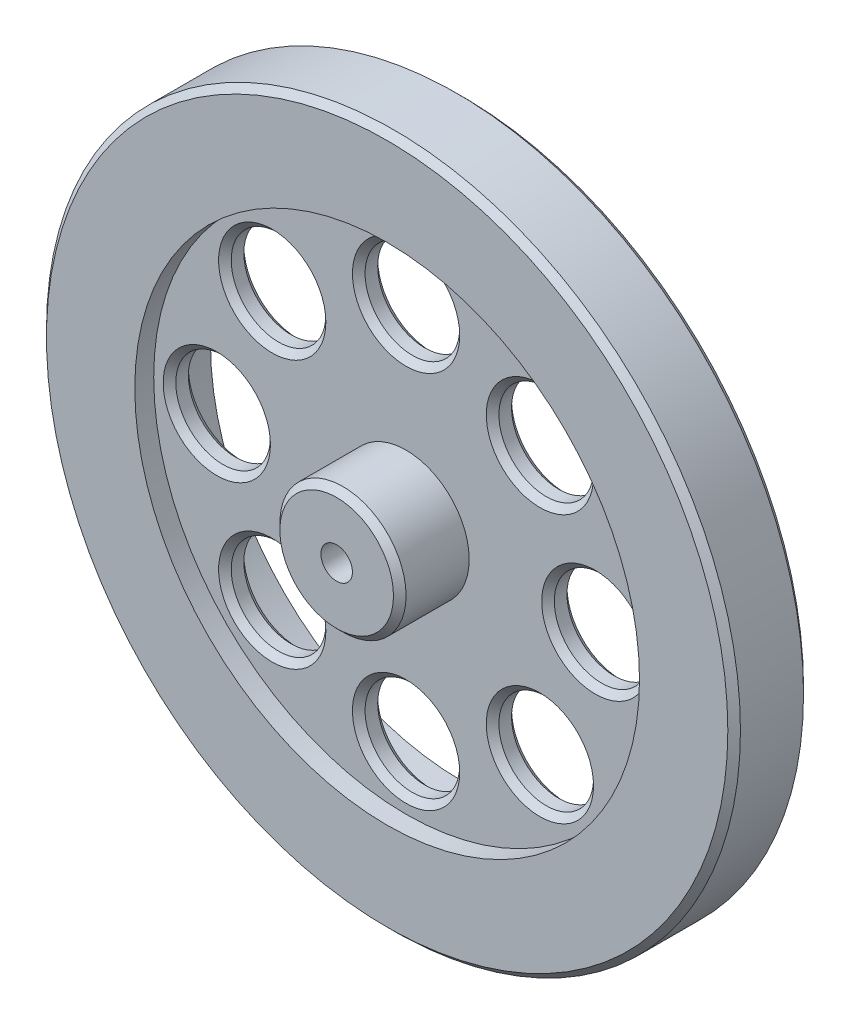
ISO-10303-21;
HEADER;
FILE_DESCRIPTION(('STEP AP214'),'2;1');
FILE_NAME('part.step','',(''),(''),'','','');
FILE_SCHEMA(('AUTOMOTIVE_DESIGN { 1 0 10303 214 1 1 1 1 }'));
ENDSEC;
DATA;
#1=APPLICATION_CONTEXT('core data for automotive mechanical design processes');
#2=APPLICATION_PROTOCOL_DEFINITION('international standard','automotive_design',2000,#1);
#3=PRODUCT_CONTEXT('',#1,'mechanical');
#4=PRODUCT('Part','Part','',(#3));
#5=PRODUCT_RELATED_PRODUCT_CATEGORY('part','',(#4));
#6=PRODUCT_DEFINITION_FORMATION('','',#4);
#7=PRODUCT_DEFINITION_CONTEXT('part definition',#1,'design');
#8=PRODUCT_DEFINITION('design','',#6,#7);
#9=PRODUCT_DEFINITION_SHAPE('','',#8);
#10=(LENGTH_UNIT() NAMED_UNIT(*) SI_UNIT(.MILLI.,.METRE.));
#11=(NAMED_UNIT(*) PLANE_ANGLE_UNIT() SI_UNIT($,.RADIAN.));
#12=(NAMED_UNIT(*) SI_UNIT($,.STERADIAN.) SOLID_ANGLE_UNIT());
#13=UNCERTAINTY_MEASURE_WITH_UNIT(LENGTH_MEASURE(1.E-05),#10,'distance_accuracy_value','');
#14=(GEOMETRIC_REPRESENTATION_CONTEXT(3) GLOBAL_UNCERTAINTY_ASSIGNED_CONTEXT((#13)) GLOBAL_UNIT_ASSIGNED_CONTEXT((#10,
#11,#12)) REPRESENTATION_CONTEXT('',''));
#15=CARTESIAN_POINT('',(0.,0.,0.));
#16=DIRECTION('',(0.,0.,1.));
#17=DIRECTION('',(1.,0.,0.));
#18=AXIS2_PLACEMENT_3D('',#15,#16,#17);
#19=CARTESIAN_POINT('',(0.,0.,12.));
#20=DIRECTION('',(0.,0.,-1.));
#21=DIRECTION('',(-1.,0.,0.));
#22=AXIS2_PLACEMENT_3D('',#19,#20,#21);
#23=CYLINDRICAL_SURFACE('',#22,55.);
#24=CARTESIAN_POINT('',(0.,0.,11.));
#25=DIRECTION('',(0.,0.,1.));
#26=DIRECTION('',(1.,0.,0.));
#27=AXIS2_PLACEMENT_3D('',#24,#25,#26);
#28=CIRCLE('',#27,55.);
#29=CARTESIAN_POINT('',(55.,0.,11.));
#30=VERTEX_POINT('',#29);
#31=EDGE_CURVE('E149',#30,#30,#28,.F.);
#32=ORIENTED_EDGE('',*,*,#31,.T.);
#33=EDGE_LOOP('',(#32));
#34=FACE_BOUND('',#33,.T.);
#35=CARTESIAN_POINT('',(0.,0.,1.00000000000001));
#36=DIRECTION('',(0.,0.,1.));
#37=DIRECTION('',(1.,0.,0.));
#38=AXIS2_PLACEMENT_3D('',#35,#36,#37);
#39=CIRCLE('',#38,55.);
#40=CARTESIAN_POINT('',(55.,0.,1.00000000000001));
#41=VERTEX_POINT('',#40);
#42=EDGE_CURVE('E152',#41,#41,#39,.T.);
#43=ORIENTED_EDGE('',*,*,#42,.T.);
#44=EDGE_LOOP('',(#43));
#45=FACE_BOUND('',#44,.T.);
#46=ADVANCED_FACE('F35',(#34,#45),#23,.T.);
#47=CARTESIAN_POINT('',(0.,0.,12.));
#48=DIRECTION('',(0.,0.,1.));
#49=DIRECTION('',(1.,0.,0.));
#50=AXIS2_PLACEMENT_3D('',#47,#48,#49);
#51=PLANE('',#50);
#52=CARTESIAN_POINT('',(0.,0.,12.));
#53=DIRECTION('',(0.,0.,1.));
#54=DIRECTION('',(1.,0.,0.));
#55=AXIS2_PLACEMENT_3D('',#52,#53,#54);
#56=CIRCLE('',#55,54.);
#57=CARTESIAN_POINT('',(54.,0.,12.));
#58=VERTEX_POINT('',#57);
#59=EDGE_CURVE('E155',#58,#58,#56,.T.);
#60=ORIENTED_EDGE('',*,*,#59,.T.);
#61=EDGE_LOOP('',(#60));
#62=FACE_BOUND('',#61,.T.);
#63=CARTESIAN_POINT('',(0.,0.,12.));
#64=DIRECTION('',(0.,0.,1.));
#65=DIRECTION('',(1.,0.,0.));
#66=AXIS2_PLACEMENT_3D('',#63,#64,#65);
#67=CIRCLE('',#66,40.);
#68=CARTESIAN_POINT('',(40.,0.,12.));
#69=VERTEX_POINT('',#68);
#70=EDGE_CURVE('E165',#69,#69,#67,.T.);
#71=ORIENTED_EDGE('',*,*,#70,.F.);
#72=EDGE_LOOP('',(#71));
#73=FACE_BOUND('',#72,.T.);
#74=ADVANCED_FACE('F198',(#62,#73),#51,.T.);
#75=CARTESIAN_POINT('',(0.,0.,0.));
#76=DIRECTION('',(0.,0.,1.));
#77=DIRECTION('',(1.,0.,0.));
#78=AXIS2_PLACEMENT_3D('',#75,#76,#77);
#79=PLANE('',#78);
#80=CARTESIAN_POINT('',(0.,0.,0.));
#81=DIRECTION('',(0.,0.,1.));
#82=DIRECTION('',(1.,0.,0.));
#83=AXIS2_PLACEMENT_3D('',#80,#81,#82);
#84=CIRCLE('',#83,54.);
#85=CARTESIAN_POINT('',(54.,0.,0.));
#86=VERTEX_POINT('',#85);
#87=EDGE_CURVE('E10',#86,#86,#84,.F.);
#88=ORIENTED_EDGE('',*,*,#87,.T.);
#89=EDGE_LOOP('',(#88));
#90=FACE_BOUND('',#89,.T.);
#91=CARTESIAN_POINT('',(0.,0.,0.));
#92=DIRECTION('',(0.,0.,-1.));
#93=DIRECTION('',(-1.,0.,0.));
#94=AXIS2_PLACEMENT_3D('',#91,#92,#93);
#95=CIRCLE('',#94,40.);
#96=CARTESIAN_POINT('',(-40.,0.,0.));
#97=VERTEX_POINT('',#96);
#98=EDGE_CURVE('E159',#97,#97,#95,.T.);
#99=ORIENTED_EDGE('',*,*,#98,.F.);
#100=EDGE_LOOP('',(#99));
#101=FACE_BOUND('',#100,.T.);
#102=ADVANCED_FACE('F204',(#90,#101),#79,.F.);
#103=CARTESIAN_POINT('',(0.,0.,5.));
#104=DIRECTION('',(0.,0.,-1.));
#105=DIRECTION('',(-1.,0.,0.));
#106=AXIS2_PLACEMENT_3D('',#103,#104,#105);
#107=CYLINDRICAL_SURFACE('',#106,40.);
#108=CARTESIAN_POINT('',(0.,0.,5.));
#109=DIRECTION('',(0.,0.,-1.));
#110=DIRECTION('',(-1.,0.,0.));
#111=AXIS2_PLACEMENT_3D('',#108,#109,#110);
#112=CIRCLE('',#111,40.);
#113=CARTESIAN_POINT('',(-40.,0.,5.));
#114=VERTEX_POINT('',#113);
#115=EDGE_CURVE('E158',#114,#114,#112,.T.);
#116=ORIENTED_EDGE('',*,*,#115,.F.);
#117=EDGE_LOOP('',(#116));
#118=FACE_BOUND('',#117,.T.);
#119=ORIENTED_EDGE('',*,*,#98,.T.);
#120=EDGE_LOOP('',(#119));
#121=FACE_BOUND('',#120,.T.);
#122=ADVANCED_FACE('F586',(#118,#121),#107,.F.);
#123=CARTESIAN_POINT('',(0.,0.,5.));
#124=DIRECTION('',(0.,0.,-1.));
#125=DIRECTION('',(-1.,0.,0.));
#126=AXIS2_PLACEMENT_3D('',#123,#124,#125);
#127=PLANE('',#126);
#128=CARTESIAN_POINT('',(-29.9999999999987,-1.27713995416946E-12,5.));
#129=DIRECTION('',(0.,0.,-1.));
#130=DIRECTION('',(-1.,0.,0.));
#131=AXIS2_PLACEMENT_3D('',#128,#129,#130);
#132=CIRCLE('',#131,8.50000000000186);
#133=CARTESIAN_POINT('',(-38.5000000000006,-1.27713995416946E-12,5.));
#134=VERTEX_POINT('',#133);
#135=EDGE_CURVE('E113',#134,#134,#132,.F.);
#136=ORIENTED_EDGE('',*,*,#135,.T.);
#137=EDGE_LOOP('',(#136));
#138=FACE_BOUND('',#137,.T.);
#139=CARTESIAN_POINT('',(-21.2132034355961,21.2132034355955,5.));
#140=DIRECTION('',(0.,0.,-1.));
#141=DIRECTION('',(-1.,0.,0.));
#142=AXIS2_PLACEMENT_3D('',#139,#140,#141);
#143=CIRCLE('',#142,8.50000000000101);
#144=CARTESIAN_POINT('',(-29.7132034355971,21.2132034355955,5.));
#145=VERTEX_POINT('',#144);
#146=EDGE_CURVE('E116',#145,#145,#143,.F.);
#147=ORIENTED_EDGE('',*,*,#146,.T.);
#148=EDGE_LOOP('',(#147));
#149=FACE_BOUND('',#148,.T.);
#150=CARTESIAN_POINT('',(0.,30.,5.));
#151=DIRECTION('',(0.,0.,-1.));
#152=DIRECTION('',(-1.,0.,0.));
#153=AXIS2_PLACEMENT_3D('',#150,#151,#152);
#154=CIRCLE('',#153,8.50000000000001);
#155=CARTESIAN_POINT('',(-8.50000000000001,30.,5.));
#156=VERTEX_POINT('',#155);
#157=EDGE_CURVE('E119',#156,#156,#154,.F.);
#158=ORIENTED_EDGE('',*,*,#157,.T.);
#159=EDGE_LOOP('',(#158));
#160=FACE_BOUND('',#159,.T.);
#161=CARTESIAN_POINT('',(21.2132034355968,21.2132034355973,5.));
#162=DIRECTION('',(0.,0.,-1.));
#163=DIRECTION('',(-1.,0.,0.));
#164=AXIS2_PLACEMENT_3D('',#161,#162,#163);
#165=CIRCLE('',#164,8.50000000000012);
#166=CARTESIAN_POINT('',(12.7132034355967,21.2132034355973,5.));
#167=VERTEX_POINT('',#166);
#168=EDGE_CURVE('E122',#167,#167,#165,.F.);
#169=ORIENTED_EDGE('',*,*,#168,.T.);
#170=EDGE_LOOP('',(#169));
#171=FACE_BOUND('',#170,.T.);
#172=CARTESIAN_POINT('',(30.0000000000013,1.27346601377202E-12,5.));
#173=DIRECTION('',(0.,0.,-1.));
#174=DIRECTION('',(-1.,0.,0.));
#175=AXIS2_PLACEMENT_3D('',#172,#173,#174);
#176=CIRCLE('',#175,8.50000000000094);
#177=CARTESIAN_POINT('',(21.5000000000003,1.27346601377202E-12,5.));
#178=VERTEX_POINT('',#177);
#179=EDGE_CURVE('E125',#178,#178,#176,.F.);
#180=ORIENTED_EDGE('',*,*,#179,.T.);
#181=EDGE_LOOP('',(#180));
#182=FACE_BOUND('',#181,.T.);
#183=CARTESIAN_POINT('',(21.2132034355986,-21.2132034355955,5.));
#184=DIRECTION('',(0.,0.,-1.));
#185=DIRECTION('',(-1.,0.,0.));
#186=AXIS2_PLACEMENT_3D('',#183,#184,#185);
#187=CIRCLE('',#186,8.50000000000198);
#188=CARTESIAN_POINT('',(12.7132034355966,-21.2132034355955,5.));
#189=VERTEX_POINT('',#188);
#190=EDGE_CURVE('E128',#189,#189,#187,.F.);
#191=ORIENTED_EDGE('',*,*,#190,.T.);
#192=EDGE_LOOP('',(#191));
#193=FACE_BOUND('',#192,.T.);
#194=CARTESIAN_POINT('',(2.54693202754403E-12,-30.,5.));
#195=DIRECTION('',(0.,0.,-1.));
#196=DIRECTION('',(-1.,0.,0.));
#197=AXIS2_PLACEMENT_3D('',#194,#195,#196);
#198=CIRCLE('',#197,8.50000000000263);
#199=CARTESIAN_POINT('',(-8.50000000000008,-30.,5.));
#200=VERTEX_POINT('',#199);
#201=EDGE_CURVE('E131',#200,#200,#198,.F.);
#202=ORIENTED_EDGE('',*,*,#201,.T.);
#203=EDGE_LOOP('',(#202));
#204=FACE_BOUND('',#203,.T.);
#205=CARTESIAN_POINT('',(-21.2132034355943,-21.2132034355973,5.));
#206=DIRECTION('',(0.,0.,-1.));
#207=DIRECTION('',(-1.,0.,0.));
#208=AXIS2_PLACEMENT_3D('',#205,#206,#207);
#209=CIRCLE('',#208,8.50000000000257);
#210=CARTESIAN_POINT('',(-29.7132034355968,-21.2132034355973,5.));
#211=VERTEX_POINT('',#210);
#212=EDGE_CURVE('E134',#211,#211,#209,.F.);
#213=ORIENTED_EDGE('',*,*,#212,.T.);
#214=EDGE_LOOP('',(#213));
#215=FACE_BOUND('',#214,.T.);
#216=CARTESIAN_POINT('',(0.,0.,5.));
#217=DIRECTION('',(0.,0.,-1.));
#218=DIRECTION('',(-1.,0.,0.));
#219=AXIS2_PLACEMENT_3D('',#216,#217,#218);
#220=CIRCLE('',#219,2.5);
#221=CARTESIAN_POINT('',(-2.5,0.,5.));
#222=VERTEX_POINT('',#221);
#223=EDGE_CURVE('E173',#222,#222,#220,.T.);
#224=ORIENTED_EDGE('',*,*,#223,.F.);
#225=EDGE_LOOP('',(#224));
#226=FACE_BOUND('',#225,.T.);
#227=ORIENTED_EDGE('',*,*,#115,.T.);
#228=EDGE_LOOP('',(#227));
#229=FACE_BOUND('',#228,.T.);
#230=ADVANCED_FACE('F577',(#138,#149,#160,#171,#182,#193,#204,#215,#226,#229),#127,.T.);
#231=CARTESIAN_POINT('',(0.,0.,9.));
#232=DIRECTION('',(0.,0.,1.));
#233=DIRECTION('',(1.,0.,0.));
#234=AXIS2_PLACEMENT_3D('',#231,#232,#233);
#235=CYLINDRICAL_SURFACE('',#234,40.);
#236=CARTESIAN_POINT('',(0.,0.,9.));
#237=DIRECTION('',(0.,0.,1.));
#238=DIRECTION('',(1.,0.,0.));
#239=AXIS2_PLACEMENT_3D('',#236,#237,#238);
#240=CIRCLE('',#239,40.);
#241=CARTESIAN_POINT('',(40.,0.,9.));
#242=VERTEX_POINT('',#241);
#243=EDGE_CURVE('E162',#242,#242,#240,.T.);
#244=ORIENTED_EDGE('',*,*,#243,.F.);
#245=EDGE_LOOP('',(#244));
#246=FACE_BOUND('',#245,.T.);
#247=ORIENTED_EDGE('',*,*,#70,.T.);
#248=EDGE_LOOP('',(#247));
#249=FACE_BOUND('',#248,.T.);
#250=ADVANCED_FACE('F568',(#246,#249),#235,.F.);
#251=CARTESIAN_POINT('',(0.,0.,9.));
#252=DIRECTION('',(0.,0.,1.));
#253=DIRECTION('',(1.,0.,0.));
#254=AXIS2_PLACEMENT_3D('',#251,#252,#253);
#255=PLANE('',#254);
#256=CARTESIAN_POINT('',(-29.9999999999987,-1.27713995416946E-12,9.));
#257=DIRECTION('',(0.,0.,1.));
#258=DIRECTION('',(1.,0.,0.));
#259=AXIS2_PLACEMENT_3D('',#256,#257,#258);
#260=CIRCLE('',#259,8.50000000000191);
#261=CARTESIAN_POINT('',(-21.4999999999968,-1.27713995416946E-12,9.));
#262=VERTEX_POINT('',#261);
#263=EDGE_CURVE('E89',#262,#262,#260,.F.);
#264=ORIENTED_EDGE('',*,*,#263,.T.);
#265=EDGE_LOOP('',(#264));
#266=FACE_BOUND('',#265,.T.);
#267=CARTESIAN_POINT('',(-21.2132034355961,21.2132034355955,9.));
#268=DIRECTION('',(0.,0.,1.));
#269=DIRECTION('',(1.,0.,0.));
#270=AXIS2_PLACEMENT_3D('',#267,#268,#269);
#271=CIRCLE('',#270,8.50000000000101);
#272=CARTESIAN_POINT('',(-12.7132034355951,21.2132034355955,9.));
#273=VERTEX_POINT('',#272);
#274=EDGE_CURVE('E92',#273,#273,#271,.F.);
#275=ORIENTED_EDGE('',*,*,#274,.T.);
#276=EDGE_LOOP('',(#275));
#277=FACE_BOUND('',#276,.T.);
#278=CARTESIAN_POINT('',(0.,30.,9.));
#279=DIRECTION('',(0.,0.,1.));
#280=DIRECTION('',(1.,0.,0.));
#281=AXIS2_PLACEMENT_3D('',#278,#279,#280);
#282=CIRCLE('',#281,8.50000000000001);
#283=CARTESIAN_POINT('',(8.50000000000001,30.,9.));
#284=VERTEX_POINT('',#283);
#285=EDGE_CURVE('E95',#284,#284,#282,.F.);
#286=ORIENTED_EDGE('',*,*,#285,.T.);
#287=EDGE_LOOP('',(#286));
#288=FACE_BOUND('',#287,.T.);
#289=CARTESIAN_POINT('',(21.2132034355968,21.2132034355973,9.));
#290=DIRECTION('',(0.,0.,1.));
#291=DIRECTION('',(1.,0.,0.));
#292=AXIS2_PLACEMENT_3D('',#289,#290,#291);
#293=CIRCLE('',#292,8.50000000000016);
#294=CARTESIAN_POINT('',(29.713203435597,21.2132034355973,9.));
#295=VERTEX_POINT('',#294);
#296=EDGE_CURVE('E98',#295,#295,#293,.F.);
#297=ORIENTED_EDGE('',*,*,#296,.T.);
#298=EDGE_LOOP('',(#297));
#299=FACE_BOUND('',#298,.T.);
#300=CARTESIAN_POINT('',(30.0000000000013,1.27346601377202E-12,9.));
#301=DIRECTION('',(0.,0.,1.));
#302=DIRECTION('',(1.,0.,0.));
#303=AXIS2_PLACEMENT_3D('',#300,#301,#302);
#304=CIRCLE('',#303,8.50000000000094);
#305=CARTESIAN_POINT('',(38.5000000000022,1.27346601377202E-12,9.));
#306=VERTEX_POINT('',#305);
#307=EDGE_CURVE('E101',#306,#306,#304,.F.);
#308=ORIENTED_EDGE('',*,*,#307,.T.);
#309=EDGE_LOOP('',(#308));
#310=FACE_BOUND('',#309,.T.);
#311=CARTESIAN_POINT('',(21.2132034355986,-21.2132034355955,9.));
#312=DIRECTION('',(0.,0.,1.));
#313=DIRECTION('',(1.,0.,0.));
#314=AXIS2_PLACEMENT_3D('',#311,#312,#313);
#315=CIRCLE('',#314,8.50000000000199);
#316=CARTESIAN_POINT('',(29.7132034356006,-21.2132034355955,9.));
#317=VERTEX_POINT('',#316);
#318=EDGE_CURVE('E104',#317,#317,#315,.F.);
#319=ORIENTED_EDGE('',*,*,#318,.T.);
#320=EDGE_LOOP('',(#319));
#321=FACE_BOUND('',#320,.T.);
#322=CARTESIAN_POINT('',(2.54693202754403E-12,-30.,9.));
#323=DIRECTION('',(0.,0.,1.));
#324=DIRECTION('',(1.,0.,0.));
#325=AXIS2_PLACEMENT_3D('',#322,#323,#324);
#326=CIRCLE('',#325,8.50000000000263);
#327=CARTESIAN_POINT('',(8.50000000000518,-30.,9.));
#328=VERTEX_POINT('',#327);
#329=EDGE_CURVE('E107',#328,#328,#326,.F.);
#330=ORIENTED_EDGE('',*,*,#329,.T.);
#331=EDGE_LOOP('',(#330));
#332=FACE_BOUND('',#331,.T.);
#333=CARTESIAN_POINT('',(-21.2132034355943,-21.2132034355973,9.));
#334=DIRECTION('',(0.,0.,1.));
#335=DIRECTION('',(1.,0.,0.));
#336=AXIS2_PLACEMENT_3D('',#333,#334,#335);
#337=CIRCLE('',#336,8.50000000000261);
#338=CARTESIAN_POINT('',(-12.7132034355916,-21.2132034355973,9.));
#339=VERTEX_POINT('',#338);
#340=EDGE_CURVE('E110',#339,#339,#337,.F.);
#341=ORIENTED_EDGE('',*,*,#340,.T.);
#342=EDGE_LOOP('',(#341));
#343=FACE_BOUND('',#342,.T.);
#344=CARTESIAN_POINT('',(0.,0.,9.));
#345=DIRECTION('',(0.,0.,1.));
#346=DIRECTION('',(1.,0.,0.));
#347=AXIS2_PLACEMENT_3D('',#344,#345,#346);
#348=CIRCLE('',#347,10.);
#349=CARTESIAN_POINT('',(10.,0.,9.));
#350=VERTEX_POINT('',#349);
#351=EDGE_CURVE('E168',#350,#350,#348,.T.);
#352=ORIENTED_EDGE('',*,*,#351,.F.);
#353=EDGE_LOOP('',(#352));
#354=FACE_BOUND('',#353,.T.);
#355=ORIENTED_EDGE('',*,*,#243,.T.);
#356=EDGE_LOOP('',(#355));
#357=FACE_BOUND('',#356,.T.);
#358=ADVANCED_FACE('F194',(#266,#277,#288,#299,#310,#321,#332,#343,#354,#357),#255,.T.);
#359=CARTESIAN_POINT('',(0.,0.,20.));
#360=DIRECTION('',(0.,0.,-1.));
#361=DIRECTION('',(-1.,0.,0.));
#362=AXIS2_PLACEMENT_3D('',#359,#360,#361);
#363=CYLINDRICAL_SURFACE('',#362,10.);
#364=CARTESIAN_POINT('',(0.,0.,19.));
#365=DIRECTION('',(0.,0.,1.));
#366=DIRECTION('',(1.,0.,0.));
#367=AXIS2_PLACEMENT_3D('',#364,#365,#366);
#368=CIRCLE('',#367,10.);
#369=CARTESIAN_POINT('',(10.,0.,19.));
#370=VERTEX_POINT('',#369);
#371=EDGE_CURVE('E143',#370,#370,#368,.F.);
#372=ORIENTED_EDGE('',*,*,#371,.T.);
#373=EDGE_LOOP('',(#372));
#374=FACE_BOUND('',#373,.T.);
#375=ORIENTED_EDGE('',*,*,#351,.T.);
#376=EDGE_LOOP('',(#375));
#377=FACE_BOUND('',#376,.T.);
#378=ADVANCED_FACE('F184',(#374,#377),#363,.T.);
#379=CARTESIAN_POINT('',(0.,0.,20.));
#380=DIRECTION('',(0.,0.,1.));
#381=DIRECTION('',(1.,0.,0.));
#382=AXIS2_PLACEMENT_3D('',#379,#380,#381);
#383=PLANE('',#382);
#384=CARTESIAN_POINT('',(0.,0.,20.));
#385=DIRECTION('',(0.,0.,1.));
#386=DIRECTION('',(1.,0.,0.));
#387=AXIS2_PLACEMENT_3D('',#384,#385,#386);
#388=CIRCLE('',#387,9.00000000000002);
#389=CARTESIAN_POINT('',(9.00000000000002,0.,20.));
#390=VERTEX_POINT('',#389);
#391=EDGE_CURVE('E146',#390,#390,#388,.T.);
#392=ORIENTED_EDGE('',*,*,#391,.T.);
#393=EDGE_LOOP('',(#392));
#394=FACE_BOUND('',#393,.T.);
#395=CARTESIAN_POINT('',(0.,0.,20.));
#396=DIRECTION('',(0.,0.,1.));
#397=DIRECTION('',(1.,0.,0.));
#398=AXIS2_PLACEMENT_3D('',#395,#396,#397);
#399=CIRCLE('',#398,2.5);
#400=CARTESIAN_POINT('',(2.5,0.,20.));
#401=VERTEX_POINT('',#400);
#402=EDGE_CURVE('E176',#401,#401,#399,.T.);
#403=ORIENTED_EDGE('',*,*,#402,.F.);
#404=EDGE_LOOP('',(#403));
#405=FACE_BOUND('',#404,.T.);
#406=ADVANCED_FACE('F182',(#394,#405),#383,.T.);
#407=CARTESIAN_POINT('',(0.,0.,0.));
#408=DIRECTION('',(0.,0.,1.));
#409=DIRECTION('',(1.,0.,0.));
#410=AXIS2_PLACEMENT_3D('',#407,#408,#409);
#411=CYLINDRICAL_SURFACE('',#410,2.5);
#412=ORIENTED_EDGE('',*,*,#223,.T.);
#413=EDGE_LOOP('',(#412));
#414=FACE_BOUND('',#413,.T.);
#415=ORIENTED_EDGE('',*,*,#402,.T.);
#416=EDGE_LOOP('',(#415));
#417=FACE_BOUND('',#416,.T.);
#418=ADVANCED_FACE('F180',(#414,#417),#411,.F.);
#419=CARTESIAN_POINT('',(0.,30.,0.));
#420=DIRECTION('',(0.,0.,1.));
#421=DIRECTION('',(1.,0.,0.));
#422=AXIS2_PLACEMENT_3D('',#419,#420,#421);
#423=CYLINDRICAL_SURFACE('',#422,7.5);
#424=CARTESIAN_POINT('',(0.,30.,6.00000000000001));
#425=DIRECTION('',(0.,0.,-1.));
#426=DIRECTION('',(-1.,0.,0.));
#427=AXIS2_PLACEMENT_3D('',#424,#425,#426);
#428=CIRCLE('',#427,7.5);
#429=CARTESIAN_POINT('',(-7.5,30.,6.00000000000001));
#430=VERTEX_POINT('',#429);
#431=EDGE_CURVE('E77',#430,#430,#428,.T.);
#432=ORIENTED_EDGE('',*,*,#431,.T.);
#433=EDGE_LOOP('',(#432));
#434=FACE_BOUND('',#433,.T.);
#435=CARTESIAN_POINT('',(0.,30.,7.99999999999999));
#436=DIRECTION('',(0.,0.,1.));
#437=DIRECTION('',(1.,0.,0.));
#438=AXIS2_PLACEMENT_3D('',#435,#436,#437);
#439=CIRCLE('',#438,7.5);
#440=CARTESIAN_POINT('',(7.5,30.,7.99999999999999));
#441=VERTEX_POINT('',#440);
#442=EDGE_CURVE('E80',#441,#441,#439,.T.);
#443=ORIENTED_EDGE('',*,*,#442,.T.);
#444=EDGE_LOOP('',(#443));
#445=FACE_BOUND('',#444,.T.);
#446=ADVANCED_FACE('F191',(#434,#445),#423,.F.);
#447=CARTESIAN_POINT('',(21.2132034355968,21.2132034355973,0.));
#448=DIRECTION('',(0.,0.,1.));
#449=DIRECTION('',(1.,0.,0.));
#450=AXIS2_PLACEMENT_3D('',#447,#448,#449);
#451=CYLINDRICAL_SURFACE('',#450,7.50000000000014);
#452=CARTESIAN_POINT('',(21.2132034355968,21.2132034355973,7.99999999999999));
#453=DIRECTION('',(0.,0.,1.));
#454=DIRECTION('',(1.,0.,0.));
#455=AXIS2_PLACEMENT_3D('',#452,#453,#454);
#456=CIRCLE('',#455,7.50000000000014);
#457=CARTESIAN_POINT('',(28.7132034355969,21.2132034355973,7.99999999999999));
#458=VERTEX_POINT('',#457);
#459=EDGE_CURVE('E71',#458,#458,#456,.T.);
#460=ORIENTED_EDGE('',*,*,#459,.T.);
#461=EDGE_LOOP('',(#460));
#462=FACE_BOUND('',#461,.T.);
#463=CARTESIAN_POINT('',(21.2132034355968,21.2132034355973,5.99999999999997));
#464=DIRECTION('',(0.,0.,-1.));
#465=DIRECTION('',(-1.,0.,0.));
#466=AXIS2_PLACEMENT_3D('',#463,#464,#465);
#467=CIRCLE('',#466,7.50000000000014);
#468=CARTESIAN_POINT('',(13.7132034355967,21.2132034355973,5.99999999999997));
#469=VERTEX_POINT('',#468);
#470=EDGE_CURVE('E74',#469,#469,#467,.T.);
#471=ORIENTED_EDGE('',*,*,#470,.T.);
#472=EDGE_LOOP('',(#471));
#473=FACE_BOUND('',#472,.T.);
#474=ADVANCED_FACE('F363',(#462,#473),#451,.F.);
#475=CARTESIAN_POINT('',(30.0000000000013,1.27346601377202E-12,0.));
#476=DIRECTION('',(0.,0.,1.));
#477=DIRECTION('',(1.,0.,0.));
#478=AXIS2_PLACEMENT_3D('',#475,#476,#477);
#479=CYLINDRICAL_SURFACE('',#478,7.50000000000094);
#480=CARTESIAN_POINT('',(30.0000000000013,1.27346601377202E-12,7.99999999999999));
#481=DIRECTION('',(0.,0.,1.));
#482=DIRECTION('',(1.,0.,0.));
#483=AXIS2_PLACEMENT_3D('',#480,#481,#482);
#484=CIRCLE('',#483,7.50000000000094);
#485=CARTESIAN_POINT('',(37.5000000000022,1.27346601377202E-12,7.99999999999999));
#486=VERTEX_POINT('',#485);
#487=EDGE_CURVE('E65',#486,#486,#484,.T.);
#488=ORIENTED_EDGE('',*,*,#487,.T.);
#489=EDGE_LOOP('',(#488));
#490=FACE_BOUND('',#489,.T.);
#491=CARTESIAN_POINT('',(30.0000000000013,1.27346601377202E-12,6.00000000000001));
#492=DIRECTION('',(0.,0.,-1.));
#493=DIRECTION('',(-1.,0.,0.));
#494=AXIS2_PLACEMENT_3D('',#491,#492,#493);
#495=CIRCLE('',#494,7.50000000000094);
#496=CARTESIAN_POINT('',(22.5000000000003,1.27346601377202E-12,6.00000000000001));
#497=VERTEX_POINT('',#496);
#498=EDGE_CURVE('E68',#497,#497,#495,.T.);
#499=ORIENTED_EDGE('',*,*,#498,.T.);
#500=EDGE_LOOP('',(#499));
#501=FACE_BOUND('',#500,.T.);
#502=ADVANCED_FACE('F368',(#490,#501),#479,.F.);
#503=CARTESIAN_POINT('',(21.2132034355986,-21.2132034355955,0.));
#504=DIRECTION('',(0.,0.,1.));
#505=DIRECTION('',(1.,0.,0.));
#506=AXIS2_PLACEMENT_3D('',#503,#504,#505);
#507=CYLINDRICAL_SURFACE('',#506,7.50000000000197);
#508=CARTESIAN_POINT('',(21.2132034355986,-21.2132034355955,7.99999999999999));
#509=DIRECTION('',(0.,0.,1.));
#510=DIRECTION('',(1.,0.,0.));
#511=AXIS2_PLACEMENT_3D('',#508,#509,#510);
#512=CIRCLE('',#511,7.50000000000197);
#513=CARTESIAN_POINT('',(28.7132034356006,-21.2132034355955,7.99999999999999));
#514=VERTEX_POINT('',#513);
#515=EDGE_CURVE('E59',#514,#514,#512,.T.);
#516=ORIENTED_EDGE('',*,*,#515,.T.);
#517=EDGE_LOOP('',(#516));
#518=FACE_BOUND('',#517,.T.);
#519=CARTESIAN_POINT('',(21.2132034355986,-21.2132034355955,6.00000000000001));
#520=DIRECTION('',(0.,0.,-1.));
#521=DIRECTION('',(-1.,0.,0.));
#522=AXIS2_PLACEMENT_3D('',#519,#520,#521);
#523=CIRCLE('',#522,7.50000000000197);
#524=CARTESIAN_POINT('',(13.7132034355966,-21.2132034355955,6.00000000000001));
#525=VERTEX_POINT('',#524);
#526=EDGE_CURVE('E62',#525,#525,#523,.T.);
#527=ORIENTED_EDGE('',*,*,#526,.T.);
#528=EDGE_LOOP('',(#527));
#529=FACE_BOUND('',#528,.T.);
#530=ADVANCED_FACE('F354',(#518,#529),#507,.F.);
#531=CARTESIAN_POINT('',(2.54693202754403E-12,-30.,0.));
#532=DIRECTION('',(0.,0.,1.));
#533=DIRECTION('',(1.,0.,0.));
#534=AXIS2_PLACEMENT_3D('',#531,#532,#533);
#535=CYLINDRICAL_SURFACE('',#534,7.50000000000264);
#536=CARTESIAN_POINT('',(2.54693202754403E-12,-30.,8.00000000000001));
#537=DIRECTION('',(0.,0.,1.));
#538=DIRECTION('',(1.,0.,0.));
#539=AXIS2_PLACEMENT_3D('',#536,#537,#538);
#540=CIRCLE('',#539,7.50000000000264);
#541=CARTESIAN_POINT('',(7.50000000000518,-30.,8.00000000000001));
#542=VERTEX_POINT('',#541);
#543=EDGE_CURVE('E51',#542,#542,#540,.T.);
#544=ORIENTED_EDGE('',*,*,#543,.T.);
#545=EDGE_LOOP('',(#544));
#546=FACE_BOUND('',#545,.T.);
#547=CARTESIAN_POINT('',(2.54693202754403E-12,-30.,5.99999999999999));
#548=DIRECTION('',(0.,0.,-1.));
#549=DIRECTION('',(-1.,0.,0.));
#550=AXIS2_PLACEMENT_3D('',#547,#548,#549);
#551=CIRCLE('',#550,7.50000000000264);
#552=CARTESIAN_POINT('',(-7.50000000000009,-30.,5.99999999999999));
#553=VERTEX_POINT('',#552);
#554=EDGE_CURVE('E56',#553,#553,#551,.T.);
#555=ORIENTED_EDGE('',*,*,#554,.T.);
#556=EDGE_LOOP('',(#555));
#557=FACE_BOUND('',#556,.T.);
#558=ADVANCED_FACE('F346',(#546,#557),#535,.F.);
#559=CARTESIAN_POINT('',(-21.2132034355943,-21.2132034355973,0.));
#560=DIRECTION('',(0.,0.,1.));
#561=DIRECTION('',(1.,0.,0.));
#562=AXIS2_PLACEMENT_3D('',#559,#560,#561);
#563=CYLINDRICAL_SURFACE('',#562,7.5000000000026);
#564=CARTESIAN_POINT('',(-21.2132034355943,-21.2132034355973,8.));
#565=DIRECTION('',(0.,0.,1.));
#566=DIRECTION('',(1.,0.,0.));
#567=AXIS2_PLACEMENT_3D('',#564,#565,#566);
#568=CIRCLE('',#567,7.5000000000026);
#569=CARTESIAN_POINT('',(-13.7132034355917,-21.2132034355973,8.));
#570=VERTEX_POINT('',#569);
#571=EDGE_CURVE('E43',#570,#570,#568,.T.);
#572=ORIENTED_EDGE('',*,*,#571,.T.);
#573=EDGE_LOOP('',(#572));
#574=FACE_BOUND('',#573,.T.);
#575=CARTESIAN_POINT('',(-21.2132034355943,-21.2132034355973,5.99999999999998));
#576=DIRECTION('',(0.,0.,-1.));
#577=DIRECTION('',(-1.,0.,0.));
#578=AXIS2_PLACEMENT_3D('',#575,#576,#577);
#579=CIRCLE('',#578,7.5000000000026);
#580=CARTESIAN_POINT('',(-28.7132034355968,-21.2132034355973,5.99999999999998));
#581=VERTEX_POINT('',#580);
#582=EDGE_CURVE('E47',#581,#581,#579,.T.);
#583=ORIENTED_EDGE('',*,*,#582,.T.);
#584=EDGE_LOOP('',(#583));
#585=FACE_BOUND('',#584,.T.);
#586=ADVANCED_FACE('F343',(#574,#585),#563,.F.);
#587=CARTESIAN_POINT('',(-29.9999999999987,-1.27713995416946E-12,0.));
#588=DIRECTION('',(0.,0.,1.));
#589=DIRECTION('',(1.,0.,0.));
#590=AXIS2_PLACEMENT_3D('',#587,#588,#589);
#591=CYLINDRICAL_SURFACE('',#590,7.50000000000189);
#592=CARTESIAN_POINT('',(-29.9999999999987,-1.27713995416946E-12,5.99999999999997));
#593=DIRECTION('',(0.,0.,-1.));
#594=DIRECTION('',(-1.,0.,0.));
#595=AXIS2_PLACEMENT_3D('',#592,#593,#594);
#596=CIRCLE('',#595,7.50000000000189);
#597=CARTESIAN_POINT('',(-37.5000000000006,-1.27713995416946E-12,5.99999999999997));
#598=VERTEX_POINT('',#597);
#599=EDGE_CURVE('E137',#598,#598,#596,.T.);
#600=ORIENTED_EDGE('',*,*,#599,.T.);
#601=EDGE_LOOP('',(#600));
#602=FACE_BOUND('',#601,.T.);
#603=CARTESIAN_POINT('',(-29.9999999999987,-1.27713995416946E-12,8.));
#604=DIRECTION('',(0.,0.,1.));
#605=DIRECTION('',(1.,0.,0.));
#606=AXIS2_PLACEMENT_3D('',#603,#604,#605);
#607=CIRCLE('',#606,7.50000000000189);
#608=CARTESIAN_POINT('',(-22.4999999999968,-1.27713995416946E-12,8.));
#609=VERTEX_POINT('',#608);
#610=EDGE_CURVE('E140',#609,#609,#607,.T.);
#611=ORIENTED_EDGE('',*,*,#610,.T.);
#612=EDGE_LOOP('',(#611));
#613=FACE_BOUND('',#612,.T.);
#614=ADVANCED_FACE('F345',(#602,#613),#591,.F.);
#615=CARTESIAN_POINT('',(-21.2132034355961,21.2132034355955,0.));
#616=DIRECTION('',(0.,0.,1.));
#617=DIRECTION('',(1.,0.,0.));
#618=AXIS2_PLACEMENT_3D('',#615,#616,#617);
#619=CYLINDRICAL_SURFACE('',#618,7.50000000000098);
#620=CARTESIAN_POINT('',(-21.2132034355961,21.2132034355955,6.00000000000003));
#621=DIRECTION('',(0.,0.,-1.));
#622=DIRECTION('',(-1.,0.,0.));
#623=AXIS2_PLACEMENT_3D('',#620,#621,#622);
#624=CIRCLE('',#623,7.50000000000098);
#625=CARTESIAN_POINT('',(-28.713203435597,21.2132034355955,6.00000000000003));
#626=VERTEX_POINT('',#625);
#627=EDGE_CURVE('E83',#626,#626,#624,.T.);
#628=ORIENTED_EDGE('',*,*,#627,.T.);
#629=EDGE_LOOP('',(#628));
#630=FACE_BOUND('',#629,.T.);
#631=CARTESIAN_POINT('',(-21.2132034355961,21.2132034355955,7.99999999999998));
#632=DIRECTION('',(0.,0.,1.));
#633=DIRECTION('',(1.,0.,0.));
#634=AXIS2_PLACEMENT_3D('',#631,#632,#633);
#635=CIRCLE('',#634,7.50000000000098);
#636=CARTESIAN_POINT('',(-13.7132034355951,21.2132034355955,7.99999999999998));
#637=VERTEX_POINT('',#636);
#638=EDGE_CURVE('E86',#637,#637,#635,.T.);
#639=ORIENTED_EDGE('',*,*,#638,.T.);
#640=EDGE_LOOP('',(#639));
#641=FACE_BOUND('',#640,.T.);
#642=ADVANCED_FACE('F218',(#630,#641),#619,.F.);
#643=CARTESIAN_POINT('',(0.,0.,12.));
#644=DIRECTION('',(0.,0.,-1.));
#645=DIRECTION('',(-1.,0.,0.));
#646=AXIS2_PLACEMENT_3D('',#643,#644,#645);
#647=CONICAL_SURFACE('',#646,54.,0.785398163397448);
#648=ORIENTED_EDGE('',*,*,#31,.F.);
#649=EDGE_LOOP('',(#648));
#650=FACE_BOUND('',#649,.T.);
#651=ORIENTED_EDGE('',*,*,#59,.F.);
#652=EDGE_LOOP('',(#651));
#653=FACE_BOUND('',#652,.T.);
#654=ADVANCED_FACE('F211',(#650,#653),#647,.T.);
#655=CARTESIAN_POINT('',(0.,0.,20.));
#656=DIRECTION('',(0.,0.,-1.));
#657=DIRECTION('',(-1.,0.,0.));
#658=AXIS2_PLACEMENT_3D('',#655,#656,#657);
#659=CONICAL_SURFACE('',#658,9.00000000000002,0.785398163397451);
#660=ORIENTED_EDGE('',*,*,#371,.F.);
#661=EDGE_LOOP('',(#660));
#662=FACE_BOUND('',#661,.T.);
#663=ORIENTED_EDGE('',*,*,#391,.F.);
#664=EDGE_LOOP('',(#663));
#665=FACE_BOUND('',#664,.T.);
#666=ADVANCED_FACE('F217',(#662,#665),#659,.T.);
#667=CARTESIAN_POINT('',(-29.9999999999987,-1.27713995416946E-12,5.99999999999997));
#668=DIRECTION('',(0.,0.,-1.));
#669=DIRECTION('',(-1.,0.,0.));
#670=AXIS2_PLACEMENT_3D('',#667,#668,#669);
#671=CONICAL_SURFACE('',#670,7.50000000000189,0.785398163397449);
#672=ORIENTED_EDGE('',*,*,#135,.F.);
#673=EDGE_LOOP('',(#672));
#674=FACE_BOUND('',#673,.T.);
#675=ORIENTED_EDGE('',*,*,#599,.F.);
#676=EDGE_LOOP('',(#675));
#677=FACE_BOUND('',#676,.T.);
#678=ADVANCED_FACE('F225',(#674,#677),#671,.F.);
#679=CARTESIAN_POINT('',(-29.9999999999987,-1.27713995416946E-12,8.));
#680=DIRECTION('',(0.,0.,1.));
#681=DIRECTION('',(1.,0.,0.));
#682=AXIS2_PLACEMENT_3D('',#679,#680,#681);
#683=CONICAL_SURFACE('',#682,7.50000000000189,0.785398163397454);
#684=ORIENTED_EDGE('',*,*,#263,.F.);
#685=EDGE_LOOP('',(#684));
#686=FACE_BOUND('',#685,.T.);
#687=ORIENTED_EDGE('',*,*,#610,.F.);
#688=EDGE_LOOP('',(#687));
#689=FACE_BOUND('',#688,.T.);
#690=ADVANCED_FACE('F232',(#686,#689),#683,.F.);
#691=CARTESIAN_POINT('',(-21.2132034355961,21.2132034355955,6.00000000000003));
#692=DIRECTION('',(0.,0.,-1.));
#693=DIRECTION('',(-1.,0.,0.));
#694=AXIS2_PLACEMENT_3D('',#691,#692,#693);
#695=CONICAL_SURFACE('',#694,7.50000000000098,0.785398163397449);
#696=ORIENTED_EDGE('',*,*,#146,.F.);
#697=EDGE_LOOP('',(#696));
#698=FACE_BOUND('',#697,.T.);
#699=ORIENTED_EDGE('',*,*,#627,.F.);
#700=EDGE_LOOP('',(#699));
#701=FACE_BOUND('',#700,.T.);
#702=ADVANCED_FACE('F239',(#698,#701),#695,.F.);
#703=CARTESIAN_POINT('',(-21.2132034355961,21.2132034355955,7.99999999999998));
#704=DIRECTION('',(0.,0.,1.));
#705=DIRECTION('',(1.,0.,0.));
#706=AXIS2_PLACEMENT_3D('',#703,#704,#705);
#707=CONICAL_SURFACE('',#706,7.50000000000098,0.785398163397456);
#708=ORIENTED_EDGE('',*,*,#274,.F.);
#709=EDGE_LOOP('',(#708));
#710=FACE_BOUND('',#709,.T.);
#711=ORIENTED_EDGE('',*,*,#638,.F.);
#712=EDGE_LOOP('',(#711));
#713=FACE_BOUND('',#712,.T.);
#714=ADVANCED_FACE('F246',(#710,#713),#707,.F.);
#715=CARTESIAN_POINT('',(0.,30.,6.00000000000001));
#716=DIRECTION('',(0.,0.,-1.));
#717=DIRECTION('',(-1.,0.,0.));
#718=AXIS2_PLACEMENT_3D('',#715,#716,#717);
#719=CONICAL_SURFACE('',#718,7.5,0.785398163397449);
#720=ORIENTED_EDGE('',*,*,#157,.F.);
#721=EDGE_LOOP('',(#720));
#722=FACE_BOUND('',#721,.T.);
#723=ORIENTED_EDGE('',*,*,#431,.F.);
#724=EDGE_LOOP('',(#723));
#725=FACE_BOUND('',#724,.T.);
#726=ADVANCED_FACE('F253',(#722,#725),#719,.F.);
#727=CARTESIAN_POINT('',(0.,30.,7.99999999999999));
#728=DIRECTION('',(0.,0.,1.));
#729=DIRECTION('',(1.,0.,0.));
#730=AXIS2_PLACEMENT_3D('',#727,#728,#729);
#731=CONICAL_SURFACE('',#730,7.5,0.785398163397448);
#732=ORIENTED_EDGE('',*,*,#285,.F.);
#733=EDGE_LOOP('',(#732));
#734=FACE_BOUND('',#733,.T.);
#735=ORIENTED_EDGE('',*,*,#442,.F.);
#736=EDGE_LOOP('',(#735));
#737=FACE_BOUND('',#736,.T.);
#738=ADVANCED_FACE('F260',(#734,#737),#731,.F.);
#739=CARTESIAN_POINT('',(21.2132034355968,21.2132034355973,7.99999999999999));
#740=DIRECTION('',(0.,0.,1.));
#741=DIRECTION('',(1.,0.,0.));
#742=AXIS2_PLACEMENT_3D('',#739,#740,#741);
#743=CONICAL_SURFACE('',#742,7.50000000000014,0.78539816339745);
#744=ORIENTED_EDGE('',*,*,#296,.F.);
#745=EDGE_LOOP('',(#744));
#746=FACE_BOUND('',#745,.T.);
#747=ORIENTED_EDGE('',*,*,#459,.F.);
#748=EDGE_LOOP('',(#747));
#749=FACE_BOUND('',#748,.T.);
#750=ADVANCED_FACE('F267',(#746,#749),#743,.F.);
#751=CARTESIAN_POINT('',(21.2132034355968,21.2132034355973,5.99999999999997));
#752=DIRECTION('',(0.,0.,-1.));
#753=DIRECTION('',(-1.,0.,0.));
#754=AXIS2_PLACEMENT_3D('',#751,#752,#753);
#755=CONICAL_SURFACE('',#754,7.50000000000014,0.78539816339745);
#756=ORIENTED_EDGE('',*,*,#168,.F.);
#757=EDGE_LOOP('',(#756));
#758=FACE_BOUND('',#757,.T.);
#759=ORIENTED_EDGE('',*,*,#470,.F.);
#760=EDGE_LOOP('',(#759));
#761=FACE_BOUND('',#760,.T.);
#762=ADVANCED_FACE('F274',(#758,#761),#755,.F.);
#763=CARTESIAN_POINT('',(30.0000000000013,1.27346601377202E-12,7.99999999999999));
#764=DIRECTION('',(0.,0.,1.));
#765=DIRECTION('',(1.,0.,0.));
#766=AXIS2_PLACEMENT_3D('',#763,#764,#765);
#767=CONICAL_SURFACE('',#766,7.50000000000094,0.785398163397442);
#768=ORIENTED_EDGE('',*,*,#307,.F.);
#769=EDGE_LOOP('',(#768));
#770=FACE_BOUND('',#769,.T.);
#771=ORIENTED_EDGE('',*,*,#487,.F.);
#772=EDGE_LOOP('',(#771));
#773=FACE_BOUND('',#772,.T.);
#774=ADVANCED_FACE('F281',(#770,#773),#767,.F.);
#775=CARTESIAN_POINT('',(30.0000000000013,1.27346601377202E-12,6.00000000000001));
#776=DIRECTION('',(0.,0.,-1.));
#777=DIRECTION('',(-1.,0.,0.));
#778=AXIS2_PLACEMENT_3D('',#775,#776,#777);
#779=CONICAL_SURFACE('',#778,7.50000000000094,0.785398163397444);
#780=ORIENTED_EDGE('',*,*,#179,.F.);
#781=EDGE_LOOP('',(#780));
#782=FACE_BOUND('',#781,.T.);
#783=ORIENTED_EDGE('',*,*,#498,.F.);
#784=EDGE_LOOP('',(#783));
#785=FACE_BOUND('',#784,.T.);
#786=ADVANCED_FACE('F288',(#782,#785),#779,.F.);
#787=CARTESIAN_POINT('',(21.2132034355986,-21.2132034355955,7.99999999999999));
#788=DIRECTION('',(0.,0.,1.));
#789=DIRECTION('',(1.,0.,0.));
#790=AXIS2_PLACEMENT_3D('',#787,#788,#789);
#791=CONICAL_SURFACE('',#790,7.50000000000197,0.785398163397456);
#792=ORIENTED_EDGE('',*,*,#318,.F.);
#793=EDGE_LOOP('',(#792));
#794=FACE_BOUND('',#793,.T.);
#795=ORIENTED_EDGE('',*,*,#515,.F.);
#796=EDGE_LOOP('',(#795));
#797=FACE_BOUND('',#796,.T.);
#798=ADVANCED_FACE('F295',(#794,#797),#791,.F.);
#799=CARTESIAN_POINT('',(21.2132034355986,-21.2132034355955,6.00000000000001));
#800=DIRECTION('',(0.,0.,-1.));
#801=DIRECTION('',(-1.,0.,0.));
#802=AXIS2_PLACEMENT_3D('',#799,#800,#801);
#803=CONICAL_SURFACE('',#802,7.50000000000197,0.785398163397449);
#804=ORIENTED_EDGE('',*,*,#190,.F.);
#805=EDGE_LOOP('',(#804));
#806=FACE_BOUND('',#805,.T.);
#807=ORIENTED_EDGE('',*,*,#526,.F.);
#808=EDGE_LOOP('',(#807));
#809=FACE_BOUND('',#808,.T.);
#810=ADVANCED_FACE('F302',(#806,#809),#803,.F.);
#811=CARTESIAN_POINT('',(2.54693202754403E-12,-30.,8.00000000000001));
#812=DIRECTION('',(0.,0.,1.));
#813=DIRECTION('',(1.,0.,0.));
#814=AXIS2_PLACEMENT_3D('',#811,#812,#813);
#815=CONICAL_SURFACE('',#814,7.50000000000264,0.785398163397449);
#816=ORIENTED_EDGE('',*,*,#329,.F.);
#817=EDGE_LOOP('',(#816));
#818=FACE_BOUND('',#817,.T.);
#819=ORIENTED_EDGE('',*,*,#543,.F.);
#820=EDGE_LOOP('',(#819));
#821=FACE_BOUND('',#820,.T.);
#822=ADVANCED_FACE('F309',(#818,#821),#815,.F.);
#823=CARTESIAN_POINT('',(2.54693202754403E-12,-30.,5.99999999999999));
#824=DIRECTION('',(0.,0.,-1.));
#825=DIRECTION('',(-1.,0.,0.));
#826=AXIS2_PLACEMENT_3D('',#823,#824,#825);
#827=CONICAL_SURFACE('',#826,7.50000000000264,0.785398163397449);
#828=ORIENTED_EDGE('',*,*,#201,.F.);
#829=EDGE_LOOP('',(#828));
#830=FACE_BOUND('',#829,.T.);
#831=ORIENTED_EDGE('',*,*,#554,.F.);
#832=EDGE_LOOP('',(#831));
#833=FACE_BOUND('',#832,.T.);
#834=ADVANCED_FACE('F316',(#830,#833),#827,.F.);
#835=CARTESIAN_POINT('',(-21.2132034355943,-21.2132034355973,8.));
#836=DIRECTION('',(0.,0.,1.));
#837=DIRECTION('',(1.,0.,0.));
#838=AXIS2_PLACEMENT_3D('',#835,#836,#837);
#839=CONICAL_SURFACE('',#838,7.5000000000026,0.785398163397454);
#840=ORIENTED_EDGE('',*,*,#340,.F.);
#841=EDGE_LOOP('',(#840));
#842=FACE_BOUND('',#841,.T.);
#843=ORIENTED_EDGE('',*,*,#571,.F.);
#844=EDGE_LOOP('',(#843));
#845=FACE_BOUND('',#844,.T.);
#846=ADVANCED_FACE('F323',(#842,#845),#839,.F.);
#847=CARTESIAN_POINT('',(-21.2132034355943,-21.2132034355973,5.99999999999998));
#848=DIRECTION('',(0.,0.,-1.));
#849=DIRECTION('',(-1.,0.,0.));
#850=AXIS2_PLACEMENT_3D('',#847,#848,#849);
#851=CONICAL_SURFACE('',#850,7.5000000000026,0.785398163397448);
#852=ORIENTED_EDGE('',*,*,#212,.F.);
#853=EDGE_LOOP('',(#852));
#854=FACE_BOUND('',#853,.T.);
#855=ORIENTED_EDGE('',*,*,#582,.F.);
#856=EDGE_LOOP('',(#855));
#857=FACE_BOUND('',#856,.T.);
#858=ADVANCED_FACE('F329',(#854,#857),#851,.F.);
#859=CARTESIAN_POINT('',(0.,0.,1.00000000000001));
#860=DIRECTION('',(0.,0.,1.));
#861=DIRECTION('',(1.,0.,0.));
#862=AXIS2_PLACEMENT_3D('',#859,#860,#861);
#863=CONICAL_SURFACE('',#862,55.,0.785398163397445);
#864=ORIENTED_EDGE('',*,*,#87,.F.);
#865=EDGE_LOOP('',(#864));
#866=FACE_BOUND('',#865,.T.);
#867=ORIENTED_EDGE('',*,*,#42,.F.);
#868=EDGE_LOOP('',(#867));
#869=FACE_BOUND('',#868,.T.);
#870=ADVANCED_FACE('F38',(#866,#869),#863,.T.);
#871=CLOSED_SHELL('',(#46,#74,#102,#122,#230,#250,#358,#378,#406,#418,#446,#474,#502,#530,#558,
#586,#614,#642,#654,#666,#678,#690,#702,#714,#726,#738,#750,#762,#774,#786,#798,#810,#822,#834,
#846,#858,#870));
#872=MANIFOLD_SOLID_BREP('B2',#871);
#873=ADVANCED_BREP_SHAPE_REPRESENTATION('',(#18,#872),#14);
#874=SHAPE_DEFINITION_REPRESENTATION(#9,#873);
ENDSEC;
END-ISO-10303-21;
